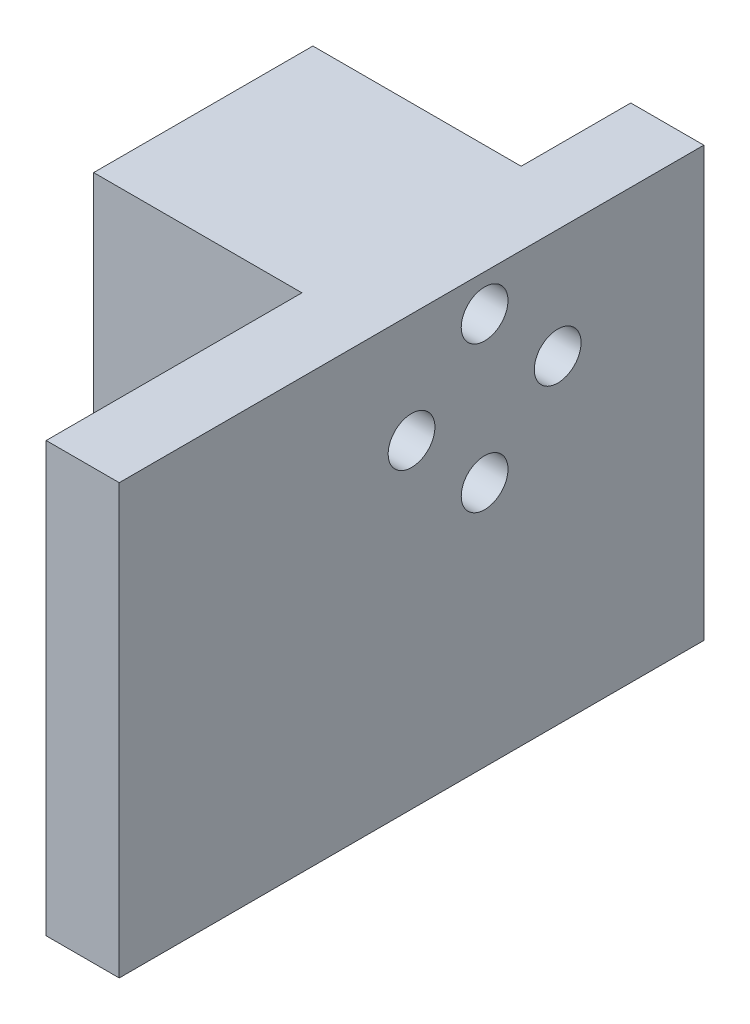
ISO-10303-21;
HEADER;
FILE_DESCRIPTION(('STEP AP214'),'2;1');
FILE_NAME('part.step','',(''),(''),'','','');
FILE_SCHEMA(('AUTOMOTIVE_DESIGN { 1 0 10303 214 1 1 1 1 }'));
ENDSEC;
DATA;
#1=APPLICATION_CONTEXT('core data for automotive mechanical design processes');
#2=APPLICATION_PROTOCOL_DEFINITION('international standard','automotive_design',2000,#1);
#3=PRODUCT_CONTEXT('',#1,'mechanical');
#4=PRODUCT('Part','Part','',(#3));
#5=PRODUCT_RELATED_PRODUCT_CATEGORY('part','',(#4));
#6=PRODUCT_DEFINITION_FORMATION('','',#4);
#7=PRODUCT_DEFINITION_CONTEXT('part definition',#1,'design');
#8=PRODUCT_DEFINITION('design','',#6,#7);
#9=PRODUCT_DEFINITION_SHAPE('','',#8);
#10=(LENGTH_UNIT() NAMED_UNIT(*) SI_UNIT(.MILLI.,.METRE.));
#11=(NAMED_UNIT(*) PLANE_ANGLE_UNIT() SI_UNIT($,.RADIAN.));
#12=(NAMED_UNIT(*) SI_UNIT($,.STERADIAN.) SOLID_ANGLE_UNIT());
#13=UNCERTAINTY_MEASURE_WITH_UNIT(LENGTH_MEASURE(1.E-05),#10,'distance_accuracy_value','');
#14=(GEOMETRIC_REPRESENTATION_CONTEXT(3) GLOBAL_UNCERTAINTY_ASSIGNED_CONTEXT((#13)) GLOBAL_UNIT_ASSIGNED_CONTEXT((#10,
#11,#12)) REPRESENTATION_CONTEXT('',''));
#15=CARTESIAN_POINT('',(0.,0.,0.));
#16=DIRECTION('',(0.,0.,1.));
#17=DIRECTION('',(1.,0.,0.));
#18=AXIS2_PLACEMENT_3D('',#15,#16,#17);
#19=CARTESIAN_POINT('',(-44.75,38.,-15.));
#20=DIRECTION('',(1.,0.,0.));
#21=DIRECTION('',(0.,0.,-1.));
#22=AXIS2_PLACEMENT_3D('',#19,#20,#21);
#23=PLANE('',#22);
#24=DIRECTION('',(0.,1.,0.));
#25=VECTOR('',#24,1.);
#26=CARTESIAN_POINT('',(-44.75,34.3499999999999,7.50000000000001));
#27=LINE('',#26,#25);
#28=CARTESIAN_POINT('',(-44.75,14.3499999999999,7.50000000000001));
#29=VERTEX_POINT('',#28);
#30=CARTESIAN_POINT('',(-44.75,34.3499999999999,7.50000000000002));
#31=VERTEX_POINT('',#30);
#32=EDGE_CURVE('E98',#29,#31,#27,.T.);
#33=ORIENTED_EDGE('',*,*,#32,.F.);
#34=DIRECTION('',(0.,0.,1.));
#35=VECTOR('',#34,1.);
#36=CARTESIAN_POINT('',(-44.75,14.3499999999999,-7.49999999999999));
#37=LINE('',#36,#35);
#38=CARTESIAN_POINT('',(-44.75,14.3499999999999,-7.49999999999999));
#39=VERTEX_POINT('',#38);
#40=EDGE_CURVE('E204',#29,#39,#37,.F.);
#41=ORIENTED_EDGE('',*,*,#40,.T.);
#42=DIRECTION('',(0.,-1.,0.));
#43=VECTOR('',#42,1.);
#44=CARTESIAN_POINT('',(-44.75,34.3499999999999,-7.49999999999999));
#45=LINE('',#44,#43);
#46=CARTESIAN_POINT('',(-44.75,34.3499999999999,-7.49999999999999));
#47=VERTEX_POINT('',#46);
#48=EDGE_CURVE('E105',#47,#39,#45,.T.);
#49=ORIENTED_EDGE('',*,*,#48,.F.);
#50=DIRECTION('',(0.,0.,1.));
#51=VECTOR('',#50,1.);
#52=CARTESIAN_POINT('',(-44.75,34.3499999999999,-85.));
#53=LINE('',#52,#51);
#54=CARTESIAN_POINT('',(-44.75,34.3499999999999,-15.));
#55=VERTEX_POINT('',#54);
#56=EDGE_CURVE('E217',#55,#47,#53,.T.);
#57=ORIENTED_EDGE('',*,*,#56,.F.);
#58=DIRECTION('',(0.,-1.,0.));
#59=VECTOR('',#58,1.);
#60=CARTESIAN_POINT('',(-44.75,38.,-15.));
#61=LINE('',#60,#59);
#62=CARTESIAN_POINT('',(-44.75,5.,-15.));
#63=VERTEX_POINT('',#62);
#64=EDGE_CURVE('E164',#55,#63,#61,.T.);
#65=ORIENTED_EDGE('',*,*,#64,.T.);
#66=DIRECTION('',(0.,0.,1.));
#67=VECTOR('',#66,1.);
#68=CARTESIAN_POINT('',(-44.75,5.,-15.));
#69=LINE('',#68,#67);
#70=CARTESIAN_POINT('',(-44.75,5.,25.));
#71=VERTEX_POINT('',#70);
#72=EDGE_CURVE('E160',#63,#71,#69,.T.);
#73=ORIENTED_EDGE('',*,*,#72,.T.);
#74=DIRECTION('',(0.,-1.,0.));
#75=VECTOR('',#74,1.);
#76=CARTESIAN_POINT('',(-44.75,38.,25.));
#77=LINE('',#76,#75);
#78=CARTESIAN_POINT('',(-44.75,34.3499999999999,25.));
#79=VERTEX_POINT('',#78);
#80=EDGE_CURVE('E185',#79,#71,#77,.T.);
#81=ORIENTED_EDGE('',*,*,#80,.F.);
#82=EDGE_CURVE('E235',#31,#79,#53,.T.);
#83=ORIENTED_EDGE('',*,*,#82,.F.);
#84=EDGE_LOOP('',(#33,#41,#49,#57,#65,#73,#81,#83));
#85=FACE_BOUND('',#84,.T.);
#86=ADVANCED_FACE('F83',(#85),#23,.F.);
#87=CARTESIAN_POINT('',(-44.75,38.,25.));
#88=DIRECTION('',(0.,0.,-1.));
#89=DIRECTION('',(-1.,0.,0.));
#90=AXIS2_PLACEMENT_3D('',#87,#88,#89);
#91=PLANE('',#90);
#92=DIRECTION('',(0.,-1.,0.));
#93=VECTOR('',#92,1.);
#94=CARTESIAN_POINT('',(-39.75,38.,25.));
#95=LINE('',#94,#93);
#96=CARTESIAN_POINT('',(-39.75,34.3499999999999,25.));
#97=VERTEX_POINT('',#96);
#98=CARTESIAN_POINT('',(-39.75,5.,25.));
#99=VERTEX_POINT('',#98);
#100=EDGE_CURVE('E173',#97,#99,#95,.T.);
#101=ORIENTED_EDGE('',*,*,#100,.F.);
#102=DIRECTION('',(1.,0.,0.));
#103=VECTOR('',#102,1.);
#104=CARTESIAN_POINT('',(-44.75,34.3499999999999,25.));
#105=LINE('',#104,#103);
#106=EDGE_CURVE('E239',#79,#97,#105,.T.);
#107=ORIENTED_EDGE('',*,*,#106,.F.);
#108=ORIENTED_EDGE('',*,*,#80,.T.);
#109=DIRECTION('',(1.,0.,0.));
#110=VECTOR('',#109,1.);
#111=CARTESIAN_POINT('',(-44.75,5.,25.));
#112=LINE('',#111,#110);
#113=EDGE_CURVE('E178',#71,#99,#112,.T.);
#114=ORIENTED_EDGE('',*,*,#113,.T.);
#115=EDGE_LOOP('',(#101,#107,#108,#114));
#116=FACE_BOUND('',#115,.T.);
#117=ADVANCED_FACE('F238',(#116),#91,.F.);
#118=CARTESIAN_POINT('',(-39.75,38.,-15.));
#119=DIRECTION('',(-1.,0.,0.));
#120=DIRECTION('',(0.,0.,1.));
#121=AXIS2_PLACEMENT_3D('',#118,#119,#120);
#122=PLANE('',#121);
#123=CARTESIAN_POINT('',(-39.75,31.85,0.));
#124=DIRECTION('',(-1.,0.,0.));
#125=DIRECTION('',(0.,0.,1.));
#126=AXIS2_PLACEMENT_3D('',#123,#124,#125);
#127=CIRCLE('',#126,1.6);
#128=CARTESIAN_POINT('',(-39.75,31.85,1.60000000000001));
#129=VERTEX_POINT('',#128);
#130=EDGE_CURVE('E199',#129,#129,#127,.T.);
#131=ORIENTED_EDGE('',*,*,#130,.T.);
#132=EDGE_LOOP('',(#131));
#133=FACE_BOUND('',#132,.T.);
#134=CARTESIAN_POINT('',(-39.75,26.8500000000001,5.00000000000015));
#135=DIRECTION('',(-1.,0.,0.));
#136=DIRECTION('',(0.,0.,1.));
#137=AXIS2_PLACEMENT_3D('',#134,#135,#136);
#138=CIRCLE('',#137,1.6);
#139=CARTESIAN_POINT('',(-39.75,26.8500000000001,6.60000000000015));
#140=VERTEX_POINT('',#139);
#141=EDGE_CURVE('E196',#140,#140,#138,.T.);
#142=ORIENTED_EDGE('',*,*,#141,.T.);
#143=EDGE_LOOP('',(#142));
#144=FACE_BOUND('',#143,.T.);
#145=CARTESIAN_POINT('',(-39.75,26.8499999999999,-4.99999999999984));
#146=DIRECTION('',(-1.,0.,0.));
#147=DIRECTION('',(0.,0.,1.));
#148=AXIS2_PLACEMENT_3D('',#145,#146,#147);
#149=CIRCLE('',#148,1.6);
#150=CARTESIAN_POINT('',(-39.75,26.8499999999999,-3.39999999999985));
#151=VERTEX_POINT('',#150);
#152=EDGE_CURVE('E192',#151,#151,#149,.T.);
#153=ORIENTED_EDGE('',*,*,#152,.T.);
#154=EDGE_LOOP('',(#153));
#155=FACE_BOUND('',#154,.T.);
#156=CARTESIAN_POINT('',(-39.75,21.85,2.58519002693258E-13));
#157=DIRECTION('',(-1.,0.,0.));
#158=DIRECTION('',(0.,0.,1.));
#159=AXIS2_PLACEMENT_3D('',#156,#157,#158);
#160=CIRCLE('',#159,1.6);
#161=CARTESIAN_POINT('',(-39.75,21.85,1.60000000000026));
#162=VERTEX_POINT('',#161);
#163=EDGE_CURVE('E189',#162,#162,#160,.T.);
#164=ORIENTED_EDGE('',*,*,#163,.T.);
#165=EDGE_LOOP('',(#164));
#166=FACE_BOUND('',#165,.T.);
#167=DIRECTION('',(0.,-1.,0.));
#168=VECTOR('',#167,1.);
#169=CARTESIAN_POINT('',(-39.75,38.,-15.));
#170=LINE('',#169,#168);
#171=CARTESIAN_POINT('',(-39.75,34.3499999999999,-15.));
#172=VERTEX_POINT('',#171);
#173=CARTESIAN_POINT('',(-39.75,5.,-15.));
#174=VERTEX_POINT('',#173);
#175=EDGE_CURVE('E168',#172,#174,#170,.T.);
#176=ORIENTED_EDGE('',*,*,#175,.F.);
#177=DIRECTION('',(0.,0.,1.));
#178=VECTOR('',#177,1.);
#179=CARTESIAN_POINT('',(-39.75,34.3499999999999,-15.));
#180=LINE('',#179,#178);
#181=EDGE_CURVE('E244',#172,#97,#180,.T.);
#182=ORIENTED_EDGE('',*,*,#181,.T.);
#183=ORIENTED_EDGE('',*,*,#100,.T.);
#184=DIRECTION('',(0.,0.,-1.));
#185=VECTOR('',#184,1.);
#186=CARTESIAN_POINT('',(-39.75,5.,-15.));
#187=LINE('',#186,#185);
#188=EDGE_CURVE('E157',#99,#174,#187,.T.);
#189=ORIENTED_EDGE('',*,*,#188,.T.);
#190=EDGE_LOOP('',(#176,#182,#183,#189));
#191=FACE_BOUND('',#190,.T.);
#192=ADVANCED_FACE('F175',(#133,#144,#155,#166,#191),#122,.F.);
#193=CARTESIAN_POINT('',(-44.75,38.,-15.));
#194=DIRECTION('',(0.,0.,1.));
#195=DIRECTION('',(1.,0.,0.));
#196=AXIS2_PLACEMENT_3D('',#193,#194,#195);
#197=PLANE('',#196);
#198=ORIENTED_EDGE('',*,*,#64,.F.);
#199=DIRECTION('',(1.,0.,0.));
#200=VECTOR('',#199,1.);
#201=CARTESIAN_POINT('',(-44.75,34.3499999999999,-15.));
#202=LINE('',#201,#200);
#203=EDGE_CURVE('E170',#55,#172,#202,.T.);
#204=ORIENTED_EDGE('',*,*,#203,.T.);
#205=ORIENTED_EDGE('',*,*,#175,.T.);
#206=DIRECTION('',(-1.,0.,0.));
#207=VECTOR('',#206,1.);
#208=CARTESIAN_POINT('',(-44.75,5.,-15.));
#209=LINE('',#208,#207);
#210=EDGE_CURVE('E153',#174,#63,#209,.T.);
#211=ORIENTED_EDGE('',*,*,#210,.T.);
#212=EDGE_LOOP('',(#198,#204,#205,#211));
#213=FACE_BOUND('',#212,.T.);
#214=ADVANCED_FACE('F169',(#213),#197,.F.);
#215=CARTESIAN_POINT('',(5.25000000000003,21.85,2.50712747051362E-13));
#216=DIRECTION('',(-1.,0.,0.));
#217=DIRECTION('',(0.,0.,1.));
#218=AXIS2_PLACEMENT_3D('',#215,#216,#217);
#219=CYLINDRICAL_SURFACE('',#218,1.6);
#220=ORIENTED_EDGE('',*,*,#163,.F.);
#221=EDGE_LOOP('',(#220));
#222=FACE_BOUND('',#221,.T.);
#223=CARTESIAN_POINT('',(-59.,21.85,2.61858345384513E-13));
#224=DIRECTION('',(-1.,0.,0.));
#225=DIRECTION('',(0.,0.,1.));
#226=AXIS2_PLACEMENT_3D('',#223,#224,#225);
#227=CIRCLE('',#226,1.6);
#228=CARTESIAN_POINT('',(-59.,21.85,1.60000000000026));
#229=VERTEX_POINT('',#228);
#230=EDGE_CURVE('E249',#229,#229,#227,.T.);
#231=ORIENTED_EDGE('',*,*,#230,.T.);
#232=EDGE_LOOP('',(#231));
#233=FACE_BOUND('',#232,.T.);
#234=ADVANCED_FACE('F293',(#222,#233),#219,.F.);
#235=CARTESIAN_POINT('',(5.25000000000003,26.8499999999999,-4.99999999999985));
#236=DIRECTION('',(-1.,0.,0.));
#237=DIRECTION('',(0.,0.,1.));
#238=AXIS2_PLACEMENT_3D('',#235,#236,#237);
#239=CYLINDRICAL_SURFACE('',#238,1.6);
#240=ORIENTED_EDGE('',*,*,#152,.F.);
#241=EDGE_LOOP('',(#240));
#242=FACE_BOUND('',#241,.T.);
#243=CARTESIAN_POINT('',(-59.,26.8499999999999,-4.99999999999986));
#244=DIRECTION('',(-1.,0.,0.));
#245=DIRECTION('',(0.,0.,1.));
#246=AXIS2_PLACEMENT_3D('',#243,#244,#245);
#247=CIRCLE('',#246,1.6);
#248=CARTESIAN_POINT('',(-59.,26.8499999999999,-3.39999999999985));
#249=VERTEX_POINT('',#248);
#250=EDGE_CURVE('E246',#249,#249,#247,.T.);
#251=ORIENTED_EDGE('',*,*,#250,.T.);
#252=EDGE_LOOP('',(#251));
#253=FACE_BOUND('',#252,.T.);
#254=ADVANCED_FACE('F296',(#242,#253),#239,.F.);
#255=CARTESIAN_POINT('',(5.25000000000003,26.8500000000001,5.00000000000014));
#256=DIRECTION('',(-1.,0.,0.));
#257=DIRECTION('',(0.,0.,1.));
#258=AXIS2_PLACEMENT_3D('',#255,#256,#257);
#259=CYLINDRICAL_SURFACE('',#258,1.6);
#260=ORIENTED_EDGE('',*,*,#141,.F.);
#261=EDGE_LOOP('',(#260));
#262=FACE_BOUND('',#261,.T.);
#263=CARTESIAN_POINT('',(-59.,26.8500000000001,5.00000000000015));
#264=DIRECTION('',(-1.,0.,0.));
#265=DIRECTION('',(0.,0.,1.));
#266=AXIS2_PLACEMENT_3D('',#263,#264,#265);
#267=CIRCLE('',#266,1.6);
#268=CARTESIAN_POINT('',(-59.,26.8500000000001,6.60000000000015));
#269=VERTEX_POINT('',#268);
#270=EDGE_CURVE('E252',#269,#269,#267,.T.);
#271=ORIENTED_EDGE('',*,*,#270,.T.);
#272=EDGE_LOOP('',(#271));
#273=FACE_BOUND('',#272,.T.);
#274=ADVANCED_FACE('F300',(#262,#273),#259,.F.);
#275=CARTESIAN_POINT('',(5.25000000000003,31.85,0.));
#276=DIRECTION('',(-1.,0.,0.));
#277=DIRECTION('',(0.,0.,1.));
#278=AXIS2_PLACEMENT_3D('',#275,#276,#277);
#279=CYLINDRICAL_SURFACE('',#278,1.6);
#280=ORIENTED_EDGE('',*,*,#130,.F.);
#281=EDGE_LOOP('',(#280));
#282=FACE_BOUND('',#281,.T.);
#283=CARTESIAN_POINT('',(-59.,31.85,0.));
#284=DIRECTION('',(-1.,0.,0.));
#285=DIRECTION('',(0.,0.,1.));
#286=AXIS2_PLACEMENT_3D('',#283,#284,#285);
#287=CIRCLE('',#286,1.6);
#288=CARTESIAN_POINT('',(-59.,31.85,1.60000000000001));
#289=VERTEX_POINT('',#288);
#290=EDGE_CURVE('E255',#289,#289,#287,.T.);
#291=ORIENTED_EDGE('',*,*,#290,.T.);
#292=EDGE_LOOP('',(#291));
#293=FACE_BOUND('',#292,.T.);
#294=ADVANCED_FACE('F304',(#282,#293),#279,.F.);
#295=CARTESIAN_POINT('',(-59.,0.,0.));
#296=DIRECTION('',(-1.,0.,0.));
#297=DIRECTION('',(0.,0.,1.));
#298=AXIS2_PLACEMENT_3D('',#295,#296,#297);
#299=PLANE('',#298);
#300=ORIENTED_EDGE('',*,*,#230,.F.);
#301=EDGE_LOOP('',(#300));
#302=FACE_BOUND('',#301,.T.);
#303=ORIENTED_EDGE('',*,*,#290,.F.);
#304=EDGE_LOOP('',(#303));
#305=FACE_BOUND('',#304,.T.);
#306=DIRECTION('',(0.,1.,0.));
#307=VECTOR('',#306,1.);
#308=CARTESIAN_POINT('',(-59.,34.3499999999999,7.50000000000001));
#309=LINE('',#308,#307);
#310=CARTESIAN_POINT('',(-59.,19.3499999999999,7.50000000000001));
#311=VERTEX_POINT('',#310);
#312=CARTESIAN_POINT('',(-59.,34.3499999999999,7.50000000000001));
#313=VERTEX_POINT('',#312);
#314=EDGE_CURVE('E218',#311,#313,#309,.T.);
#315=ORIENTED_EDGE('',*,*,#314,.T.);
#316=DIRECTION('',(0.,0.,-1.));
#317=VECTOR('',#316,1.);
#318=CARTESIAN_POINT('',(-59.,34.3499999999999,-7.49999999999998));
#319=LINE('',#318,#317);
#320=CARTESIAN_POINT('',(-59.,34.3499999999999,-7.49999999999998));
#321=VERTEX_POINT('',#320);
#322=EDGE_CURVE('E260',#313,#321,#319,.T.);
#323=ORIENTED_EDGE('',*,*,#322,.T.);
#324=DIRECTION('',(0.,-1.,0.));
#325=VECTOR('',#324,1.);
#326=CARTESIAN_POINT('',(-59.,34.3499999999999,-7.49999999999998));
#327=LINE('',#326,#325);
#328=CARTESIAN_POINT('',(-59.,19.3499999999999,-7.49999999999998));
#329=VERTEX_POINT('',#328);
#330=EDGE_CURVE('E225',#321,#329,#327,.T.);
#331=ORIENTED_EDGE('',*,*,#330,.T.);
#332=DIRECTION('',(0.,0.,1.));
#333=VECTOR('',#332,1.);
#334=CARTESIAN_POINT('',(-59.,19.3499999999999,-7.49999999999998));
#335=LINE('',#334,#333);
#336=EDGE_CURVE('E263',#329,#311,#335,.T.);
#337=ORIENTED_EDGE('',*,*,#336,.T.);
#338=EDGE_LOOP('',(#315,#323,#331,#337));
#339=FACE_BOUND('',#338,.T.);
#340=ORIENTED_EDGE('',*,*,#270,.F.);
#341=EDGE_LOOP('',(#340));
#342=FACE_BOUND('',#341,.T.);
#343=ORIENTED_EDGE('',*,*,#250,.F.);
#344=EDGE_LOOP('',(#343));
#345=FACE_BOUND('',#344,.T.);
#346=ADVANCED_FACE('F267',(#302,#305,#339,#342,#345),#299,.T.);
#347=CARTESIAN_POINT('',(-59.,34.3499999999999,7.50000000000001));
#348=DIRECTION('',(0.,0.,-1.));
#349=DIRECTION('',(-1.,0.,0.));
#350=AXIS2_PLACEMENT_3D('',#347,#348,#349);
#351=PLANE('',#350);
#352=ORIENTED_EDGE('',*,*,#32,.T.);
#353=DIRECTION('',(1.,0.,0.));
#354=VECTOR('',#353,1.);
#355=CARTESIAN_POINT('',(-59.,34.3499999999999,7.50000000000001));
#356=LINE('',#355,#354);
#357=EDGE_CURVE('E193',#313,#31,#356,.T.);
#358=ORIENTED_EDGE('',*,*,#357,.F.);
#359=ORIENTED_EDGE('',*,*,#314,.F.);
#360=DIRECTION('',(1.,0.,0.));
#361=VECTOR('',#360,1.);
#362=CARTESIAN_POINT('',(-59.,19.3499999999999,7.50000000000001));
#363=LINE('',#362,#361);
#364=CARTESIAN_POINT('',(-49.75,19.3499999999999,7.50000000000001));
#365=VERTEX_POINT('',#364);
#366=EDGE_CURVE('E212',#311,#365,#363,.T.);
#367=ORIENTED_EDGE('',*,*,#366,.T.);
#368=CARTESIAN_POINT('',(-49.75,14.3499999999999,7.50000000000001));
#369=DIRECTION('',(0.,0.,-1.));
#370=DIRECTION('',(-1.,0.,0.));
#371=AXIS2_PLACEMENT_3D('',#368,#369,#370);
#372=CIRCLE('',#371,5.);
#373=EDGE_CURVE('E91',#365,#29,#372,.T.);
#374=ORIENTED_EDGE('',*,*,#373,.T.);
#375=EDGE_LOOP('',(#352,#358,#359,#367,#374));
#376=FACE_BOUND('',#375,.T.);
#377=ADVANCED_FACE('F208',(#376),#351,.F.);
#378=CARTESIAN_POINT('',(-59.,34.3499999999999,-7.49999999999998));
#379=DIRECTION('',(0.,-1.,0.));
#380=DIRECTION('',(0.,0.,-1.));
#381=AXIS2_PLACEMENT_3D('',#378,#379,#380);
#382=PLANE('',#381);
#383=ORIENTED_EDGE('',*,*,#357,.T.);
#384=ORIENTED_EDGE('',*,*,#82,.T.);
#385=ORIENTED_EDGE('',*,*,#106,.T.);
#386=ORIENTED_EDGE('',*,*,#181,.F.);
#387=ORIENTED_EDGE('',*,*,#203,.F.);
#388=ORIENTED_EDGE('',*,*,#56,.T.);
#389=DIRECTION('',(1.,0.,0.));
#390=VECTOR('',#389,1.);
#391=CARTESIAN_POINT('',(-59.,34.3499999999999,-7.49999999999998));
#392=LINE('',#391,#390);
#393=EDGE_CURVE('E222',#321,#47,#392,.T.);
#394=ORIENTED_EDGE('',*,*,#393,.F.);
#395=ORIENTED_EDGE('',*,*,#322,.F.);
#396=EDGE_LOOP('',(#383,#384,#385,#386,#387,#388,#394,#395));
#397=FACE_BOUND('',#396,.T.);
#398=ADVANCED_FACE('F271',(#397),#382,.F.);
#399=CARTESIAN_POINT('',(-59.,34.3499999999999,-7.49999999999998));
#400=DIRECTION('',(0.,0.,1.));
#401=DIRECTION('',(1.,0.,0.));
#402=AXIS2_PLACEMENT_3D('',#399,#400,#401);
#403=PLANE('',#402);
#404=ORIENTED_EDGE('',*,*,#48,.T.);
#405=CARTESIAN_POINT('',(-49.75,14.3499999999999,-7.49999999999999));
#406=DIRECTION('',(0.,0.,1.));
#407=DIRECTION('',(1.,0.,0.));
#408=AXIS2_PLACEMENT_3D('',#405,#406,#407);
#409=CIRCLE('',#408,5.);
#410=CARTESIAN_POINT('',(-49.75,19.3499999999999,-7.49999999999999));
#411=VERTEX_POINT('',#410);
#412=EDGE_CURVE('E12',#39,#411,#409,.T.);
#413=ORIENTED_EDGE('',*,*,#412,.T.);
#414=DIRECTION('',(1.,0.,0.));
#415=VECTOR('',#414,1.);
#416=CARTESIAN_POINT('',(-59.,19.3499999999999,-7.49999999999998));
#417=LINE('',#416,#415);
#418=EDGE_CURVE('E227',#329,#411,#417,.T.);
#419=ORIENTED_EDGE('',*,*,#418,.F.);
#420=ORIENTED_EDGE('',*,*,#330,.F.);
#421=ORIENTED_EDGE('',*,*,#393,.T.);
#422=EDGE_LOOP('',(#404,#413,#419,#420,#421));
#423=FACE_BOUND('',#422,.T.);
#424=ADVANCED_FACE('F223',(#423),#403,.F.);
#425=CARTESIAN_POINT('',(-59.,19.3499999999999,-7.49999999999998));
#426=DIRECTION('',(0.,1.,0.));
#427=DIRECTION('',(0.,0.,1.));
#428=AXIS2_PLACEMENT_3D('',#425,#426,#427);
#429=PLANE('',#428);
#430=ORIENTED_EDGE('',*,*,#418,.T.);
#431=DIRECTION('',(0.,0.,1.));
#432=VECTOR('',#431,1.);
#433=CARTESIAN_POINT('',(-49.75,19.3499999999999,7.50000000000001));
#434=LINE('',#433,#432);
#435=EDGE_CURVE('E188',#411,#365,#434,.T.);
#436=ORIENTED_EDGE('',*,*,#435,.T.);
#437=ORIENTED_EDGE('',*,*,#366,.F.);
#438=ORIENTED_EDGE('',*,*,#336,.F.);
#439=EDGE_LOOP('',(#430,#436,#437,#438));
#440=FACE_BOUND('',#439,.T.);
#441=ADVANCED_FACE('F270',(#440),#429,.F.);
#442=CARTESIAN_POINT('',(-49.75,14.3499999999999,-7.49999999999999));
#443=DIRECTION('',(0.,0.,-1.));
#444=DIRECTION('',(-1.,0.,0.));
#445=AXIS2_PLACEMENT_3D('',#442,#443,#444);
#446=CYLINDRICAL_SURFACE('',#445,5.);
#447=ORIENTED_EDGE('',*,*,#412,.F.);
#448=ORIENTED_EDGE('',*,*,#40,.F.);
#449=ORIENTED_EDGE('',*,*,#373,.F.);
#450=ORIENTED_EDGE('',*,*,#435,.F.);
#451=EDGE_LOOP('',(#447,#448,#449,#450));
#452=FACE_BOUND('',#451,.T.);
#453=ADVANCED_FACE('F85',(#452),#446,.F.);
#454=CARTESIAN_POINT('',(0.,5.,-85.));
#455=DIRECTION('',(0.,1.,0.));
#456=DIRECTION('',(0.,0.,1.));
#457=AXIS2_PLACEMENT_3D('',#454,#455,#456);
#458=PLANE('',#457);
#459=ORIENTED_EDGE('',*,*,#210,.F.);
#460=ORIENTED_EDGE('',*,*,#188,.F.);
#461=ORIENTED_EDGE('',*,*,#113,.F.);
#462=ORIENTED_EDGE('',*,*,#72,.F.);
#463=EDGE_LOOP('',(#459,#460,#461,#462));
#464=FACE_BOUND('',#463,.T.);
#465=ADVANCED_FACE('F155',(#464),#458,.F.);
#466=CLOSED_SHELL('',(#86,#117,#192,#214,#234,#254,#274,#294,#346,#377,#398,#424,#441,#453,#465));
#467=MANIFOLD_SOLID_BREP('B2',#466);
#468=ADVANCED_BREP_SHAPE_REPRESENTATION('',(#18,#467),#14);
#469=SHAPE_DEFINITION_REPRESENTATION(#9,#468);
ENDSEC;
END-ISO-10303-21;
